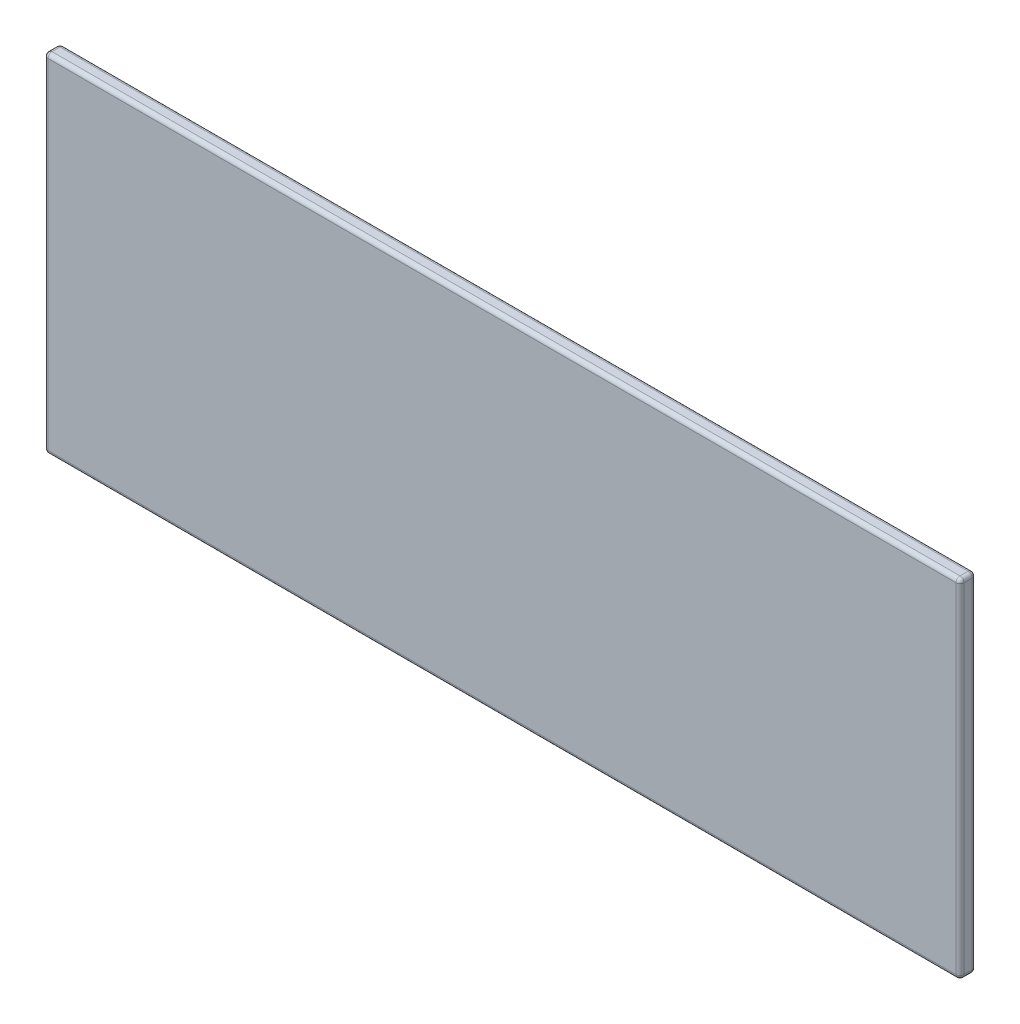
ISO-10303-21;
HEADER;
FILE_DESCRIPTION(('STEP AP214'),'2;1');
FILE_NAME('part.step','',(''),(''),'','','');
FILE_SCHEMA(('AUTOMOTIVE_DESIGN { 1 0 10303 214 1 1 1 1 }'));
ENDSEC;
DATA;
#1=APPLICATION_CONTEXT('core data for automotive mechanical design processes');
#2=APPLICATION_PROTOCOL_DEFINITION('international standard','automotive_design',2000,#1);
#3=PRODUCT_CONTEXT('',#1,'mechanical');
#4=PRODUCT('Part','Part','',(#3));
#5=PRODUCT_RELATED_PRODUCT_CATEGORY('part','',(#4));
#6=PRODUCT_DEFINITION_FORMATION('','',#4);
#7=PRODUCT_DEFINITION_CONTEXT('part definition',#1,'design');
#8=PRODUCT_DEFINITION('design','',#6,#7);
#9=PRODUCT_DEFINITION_SHAPE('','',#8);
#10=(LENGTH_UNIT() NAMED_UNIT(*) SI_UNIT(.MILLI.,.METRE.));
#11=(NAMED_UNIT(*) PLANE_ANGLE_UNIT() SI_UNIT($,.RADIAN.));
#12=(NAMED_UNIT(*) SI_UNIT($,.STERADIAN.) SOLID_ANGLE_UNIT());
#13=UNCERTAINTY_MEASURE_WITH_UNIT(LENGTH_MEASURE(1.E-05),#10,'distance_accuracy_value','');
#14=(GEOMETRIC_REPRESENTATION_CONTEXT(3) GLOBAL_UNCERTAINTY_ASSIGNED_CONTEXT((#13)) GLOBAL_UNIT_ASSIGNED_CONTEXT((#10,
#11,#12)) REPRESENTATION_CONTEXT('',''));
#15=CARTESIAN_POINT('',(0.,0.,0.));
#16=DIRECTION('',(0.,0.,1.));
#17=DIRECTION('',(1.,0.,0.));
#18=AXIS2_PLACEMENT_3D('',#15,#16,#17);
#19=CARTESIAN_POINT('',(57.35,-21.75,2.));
#20=DIRECTION('',(-1.,0.,0.));
#21=DIRECTION('',(0.,0.,1.));
#22=AXIS2_PLACEMENT_3D('',#19,#20,#21);
#23=PLANE('',#22);
#24=DIRECTION('',(0.,1.,0.));
#25=VECTOR('',#24,1.);
#26=CARTESIAN_POINT('',(57.35,-21.75,1.5));
#27=LINE('',#26,#25);
#28=CARTESIAN_POINT('',(57.35,21.25,1.5));
#29=VERTEX_POINT('',#28);
#30=CARTESIAN_POINT('',(57.35,-21.25,1.5));
#31=VERTEX_POINT('',#30);
#32=EDGE_CURVE('E42',#29,#31,#27,.F.);
#33=ORIENTED_EDGE('',*,*,#32,.T.);
#34=DIRECTION('',(0.,0.,-1.));
#35=VECTOR('',#34,1.);
#36=CARTESIAN_POINT('',(57.35,-21.25,2.));
#37=LINE('',#36,#35);
#38=CARTESIAN_POINT('',(57.35,-21.25,0.5));
#39=VERTEX_POINT('',#38);
#40=EDGE_CURVE('E11',#31,#39,#37,.T.);
#41=ORIENTED_EDGE('',*,*,#40,.T.);
#42=DIRECTION('',(0.,1.,0.));
#43=VECTOR('',#42,1.);
#44=CARTESIAN_POINT('',(57.35,21.75,0.5));
#45=LINE('',#44,#43);
#46=CARTESIAN_POINT('',(57.35,21.25,0.5));
#47=VERTEX_POINT('',#46);
#48=EDGE_CURVE('E194',#39,#47,#45,.T.);
#49=ORIENTED_EDGE('',*,*,#48,.T.);
#50=DIRECTION('',(0.,0.,-1.));
#51=VECTOR('',#50,1.);
#52=CARTESIAN_POINT('',(57.35,21.25,2.));
#53=LINE('',#52,#51);
#54=EDGE_CURVE('E53',#47,#29,#53,.F.);
#55=ORIENTED_EDGE('',*,*,#54,.T.);
#56=EDGE_LOOP('',(#33,#41,#49,#55));
#57=FACE_BOUND('',#56,.T.);
#58=ADVANCED_FACE('F33',(#57),#23,.F.);
#59=CARTESIAN_POINT('',(-57.35,21.75,2.));
#60=DIRECTION('',(0.,-1.,0.));
#61=DIRECTION('',(0.,0.,-1.));
#62=AXIS2_PLACEMENT_3D('',#59,#60,#61);
#63=PLANE('',#62);
#64=DIRECTION('',(0.,0.,-1.));
#65=VECTOR('',#64,1.);
#66=CARTESIAN_POINT('',(-56.85,21.75,2.));
#67=LINE('',#66,#65);
#68=CARTESIAN_POINT('',(-56.85,21.75,0.5));
#69=VERTEX_POINT('',#68);
#70=CARTESIAN_POINT('',(-56.85,21.75,1.5));
#71=VERTEX_POINT('',#70);
#72=EDGE_CURVE('E189',#69,#71,#67,.F.);
#73=ORIENTED_EDGE('',*,*,#72,.T.);
#74=DIRECTION('',(-1.,0.,0.));
#75=VECTOR('',#74,1.);
#76=CARTESIAN_POINT('',(-57.35,21.75,1.5));
#77=LINE('',#76,#75);
#78=CARTESIAN_POINT('',(56.85,21.75,1.5));
#79=VERTEX_POINT('',#78);
#80=EDGE_CURVE('E191',#71,#79,#77,.F.);
#81=ORIENTED_EDGE('',*,*,#80,.T.);
#82=DIRECTION('',(0.,0.,-1.));
#83=VECTOR('',#82,1.);
#84=CARTESIAN_POINT('',(56.85,21.75,2.));
#85=LINE('',#84,#83);
#86=CARTESIAN_POINT('',(56.85,21.75,0.5));
#87=VERTEX_POINT('',#86);
#88=EDGE_CURVE('E185',#79,#87,#85,.T.);
#89=ORIENTED_EDGE('',*,*,#88,.T.);
#90=DIRECTION('',(-1.,0.,0.));
#91=VECTOR('',#90,1.);
#92=CARTESIAN_POINT('',(-57.35,21.75,0.5));
#93=LINE('',#92,#91);
#94=EDGE_CURVE('E187',#87,#69,#93,.T.);
#95=ORIENTED_EDGE('',*,*,#94,.T.);
#96=EDGE_LOOP('',(#73,#81,#89,#95));
#97=FACE_BOUND('',#96,.T.);
#98=ADVANCED_FACE('F278',(#97),#63,.F.);
#99=CARTESIAN_POINT('',(-57.35,-21.75,2.));
#100=DIRECTION('',(1.,0.,0.));
#101=DIRECTION('',(0.,0.,-1.));
#102=AXIS2_PLACEMENT_3D('',#99,#100,#101);
#103=PLANE('',#102);
#104=DIRECTION('',(0.,0.,-1.));
#105=VECTOR('',#104,1.);
#106=CARTESIAN_POINT('',(-57.35,-21.25,2.));
#107=LINE('',#106,#105);
#108=CARTESIAN_POINT('',(-57.35,-21.25,0.5));
#109=VERTEX_POINT('',#108);
#110=CARTESIAN_POINT('',(-57.35,-21.25,1.5));
#111=VERTEX_POINT('',#110);
#112=EDGE_CURVE('E180',#109,#111,#107,.F.);
#113=ORIENTED_EDGE('',*,*,#112,.T.);
#114=DIRECTION('',(0.,-1.,0.));
#115=VECTOR('',#114,1.);
#116=CARTESIAN_POINT('',(-57.35,-21.75,1.5));
#117=LINE('',#116,#115);
#118=CARTESIAN_POINT('',(-57.35,21.25,1.5));
#119=VERTEX_POINT('',#118);
#120=EDGE_CURVE('E182',#111,#119,#117,.F.);
#121=ORIENTED_EDGE('',*,*,#120,.T.);
#122=DIRECTION('',(0.,0.,-1.));
#123=VECTOR('',#122,1.);
#124=CARTESIAN_POINT('',(-57.35,21.25,2.));
#125=LINE('',#124,#123);
#126=CARTESIAN_POINT('',(-57.35,21.25,0.5));
#127=VERTEX_POINT('',#126);
#128=EDGE_CURVE('E176',#119,#127,#125,.T.);
#129=ORIENTED_EDGE('',*,*,#128,.T.);
#130=DIRECTION('',(0.,-1.,0.));
#131=VECTOR('',#130,1.);
#132=CARTESIAN_POINT('',(-57.35,-21.75,0.5));
#133=LINE('',#132,#131);
#134=EDGE_CURVE('E178',#127,#109,#133,.T.);
#135=ORIENTED_EDGE('',*,*,#134,.T.);
#136=EDGE_LOOP('',(#113,#121,#129,#135));
#137=FACE_BOUND('',#136,.T.);
#138=ADVANCED_FACE('F269',(#137),#103,.F.);
#139=CARTESIAN_POINT('',(-57.35,-21.75,2.));
#140=DIRECTION('',(0.,1.,0.));
#141=DIRECTION('',(0.,0.,1.));
#142=AXIS2_PLACEMENT_3D('',#139,#140,#141);
#143=PLANE('',#142);
#144=DIRECTION('',(1.,0.,0.));
#145=VECTOR('',#144,1.);
#146=CARTESIAN_POINT('',(-57.35,-21.75,1.5));
#147=LINE('',#146,#145);
#148=CARTESIAN_POINT('',(56.85,-21.75,1.5));
#149=VERTEX_POINT('',#148);
#150=CARTESIAN_POINT('',(-56.85,-21.75,1.5));
#151=VERTEX_POINT('',#150);
#152=EDGE_CURVE('E129',#149,#151,#147,.F.);
#153=ORIENTED_EDGE('',*,*,#152,.T.);
#154=DIRECTION('',(0.,0.,-1.));
#155=VECTOR('',#154,1.);
#156=CARTESIAN_POINT('',(-56.85,-21.75,2.));
#157=LINE('',#156,#155);
#158=CARTESIAN_POINT('',(-56.85,-21.75,0.5));
#159=VERTEX_POINT('',#158);
#160=EDGE_CURVE('E165',#151,#159,#157,.T.);
#161=ORIENTED_EDGE('',*,*,#160,.T.);
#162=DIRECTION('',(1.,0.,0.));
#163=VECTOR('',#162,1.);
#164=CARTESIAN_POINT('',(57.35,-21.75,0.5));
#165=LINE('',#164,#163);
#166=CARTESIAN_POINT('',(56.85,-21.75,0.5));
#167=VERTEX_POINT('',#166);
#168=EDGE_CURVE('E158',#159,#167,#165,.T.);
#169=ORIENTED_EDGE('',*,*,#168,.T.);
#170=DIRECTION('',(0.,0.,-1.));
#171=VECTOR('',#170,1.);
#172=CARTESIAN_POINT('',(56.85,-21.75,2.));
#173=LINE('',#172,#171);
#174=EDGE_CURVE('E156',#167,#149,#173,.F.);
#175=ORIENTED_EDGE('',*,*,#174,.T.);
#176=EDGE_LOOP('',(#153,#161,#169,#175));
#177=FACE_BOUND('',#176,.T.);
#178=ADVANCED_FACE('F356',(#177),#143,.F.);
#179=CARTESIAN_POINT('',(0.,0.,2.));
#180=DIRECTION('',(0.,0.,-1.));
#181=DIRECTION('',(-1.,0.,0.));
#182=AXIS2_PLACEMENT_3D('',#179,#180,#181);
#183=PLANE('',#182);
#184=DIRECTION('',(0.,-1.,0.));
#185=VECTOR('',#184,1.);
#186=CARTESIAN_POINT('',(-56.85,0.,2.));
#187=LINE('',#186,#185);
#188=CARTESIAN_POINT('',(-56.85,21.25,2.));
#189=VERTEX_POINT('',#188);
#190=CARTESIAN_POINT('',(-56.85,-21.25,2.));
#191=VERTEX_POINT('',#190);
#192=EDGE_CURVE('E154',#189,#191,#187,.T.);
#193=ORIENTED_EDGE('',*,*,#192,.T.);
#194=DIRECTION('',(1.,0.,0.));
#195=VECTOR('',#194,1.);
#196=CARTESIAN_POINT('',(0.,-21.25,2.));
#197=LINE('',#196,#195);
#198=CARTESIAN_POINT('',(56.85,-21.25,2.));
#199=VERTEX_POINT('',#198);
#200=EDGE_CURVE('E127',#191,#199,#197,.T.);
#201=ORIENTED_EDGE('',*,*,#200,.T.);
#202=DIRECTION('',(0.,1.,0.));
#203=VECTOR('',#202,1.);
#204=CARTESIAN_POINT('',(56.85,0.,2.));
#205=LINE('',#204,#203);
#206=CARTESIAN_POINT('',(56.85,21.25,2.));
#207=VERTEX_POINT('',#206);
#208=EDGE_CURVE('E144',#199,#207,#205,.T.);
#209=ORIENTED_EDGE('',*,*,#208,.T.);
#210=DIRECTION('',(-1.,0.,0.));
#211=VECTOR('',#210,1.);
#212=CARTESIAN_POINT('',(0.,21.25,2.));
#213=LINE('',#212,#211);
#214=EDGE_CURVE('E150',#207,#189,#213,.T.);
#215=ORIENTED_EDGE('',*,*,#214,.T.);
#216=EDGE_LOOP('',(#193,#201,#209,#215));
#217=FACE_BOUND('',#216,.T.);
#218=ADVANCED_FACE('F152',(#217),#183,.F.);
#219=CARTESIAN_POINT('',(0.,0.,0.));
#220=DIRECTION('',(0.,0.,-1.));
#221=DIRECTION('',(-1.,0.,0.));
#222=AXIS2_PLACEMENT_3D('',#219,#220,#221);
#223=PLANE('',#222);
#224=DIRECTION('',(0.,1.,0.));
#225=VECTOR('',#224,1.);
#226=CARTESIAN_POINT('',(56.85,-21.75,0.));
#227=LINE('',#226,#225);
#228=CARTESIAN_POINT('',(56.85,21.25,0.));
#229=VERTEX_POINT('',#228);
#230=CARTESIAN_POINT('',(56.85,-21.25,0.));
#231=VERTEX_POINT('',#230);
#232=EDGE_CURVE('E167',#229,#231,#227,.F.);
#233=ORIENTED_EDGE('',*,*,#232,.T.);
#234=DIRECTION('',(1.,0.,0.));
#235=VECTOR('',#234,1.);
#236=CARTESIAN_POINT('',(-57.35,-21.25,0.));
#237=LINE('',#236,#235);
#238=CARTESIAN_POINT('',(-56.85,-21.25,0.));
#239=VERTEX_POINT('',#238);
#240=EDGE_CURVE('E173',#231,#239,#237,.F.);
#241=ORIENTED_EDGE('',*,*,#240,.T.);
#242=DIRECTION('',(0.,-1.,0.));
#243=VECTOR('',#242,1.);
#244=CARTESIAN_POINT('',(-56.85,21.75,0.));
#245=LINE('',#244,#243);
#246=CARTESIAN_POINT('',(-56.85,21.25,0.));
#247=VERTEX_POINT('',#246);
#248=EDGE_CURVE('E171',#239,#247,#245,.F.);
#249=ORIENTED_EDGE('',*,*,#248,.T.);
#250=DIRECTION('',(-1.,0.,0.));
#251=VECTOR('',#250,1.);
#252=CARTESIAN_POINT('',(57.35,21.25,0.));
#253=LINE('',#252,#251);
#254=EDGE_CURVE('E169',#247,#229,#253,.F.);
#255=ORIENTED_EDGE('',*,*,#254,.T.);
#256=EDGE_LOOP('',(#233,#241,#249,#255));
#257=FACE_BOUND('',#256,.T.);
#258=ADVANCED_FACE('F296',(#257),#223,.T.);
#259=CARTESIAN_POINT('',(-57.35,21.25,0.5));
#260=DIRECTION('',(1.,0.,0.));
#261=DIRECTION('',(0.,0.,-1.));
#262=AXIS2_PLACEMENT_3D('',#259,#260,#261);
#263=CYLINDRICAL_SURFACE('',#262,0.5);
#264=CARTESIAN_POINT('',(-56.85,21.25,0.5));
#265=DIRECTION('',(-1.,0.,0.));
#266=DIRECTION('',(0.,0.,1.));
#267=AXIS2_PLACEMENT_3D('',#264,#265,#266);
#268=CIRCLE('',#267,0.5);
#269=EDGE_CURVE('E37',#69,#247,#268,.T.);
#270=ORIENTED_EDGE('',*,*,#269,.F.);
#271=ORIENTED_EDGE('',*,*,#94,.F.);
#272=CARTESIAN_POINT('',(56.85,21.25,0.5));
#273=DIRECTION('',(1.,0.,0.));
#274=DIRECTION('',(0.,0.,-1.));
#275=AXIS2_PLACEMENT_3D('',#272,#273,#274);
#276=CIRCLE('',#275,0.5);
#277=EDGE_CURVE('E246',#229,#87,#276,.T.);
#278=ORIENTED_EDGE('',*,*,#277,.F.);
#279=ORIENTED_EDGE('',*,*,#254,.F.);
#280=EDGE_LOOP('',(#270,#271,#278,#279));
#281=FACE_BOUND('',#280,.T.);
#282=ADVANCED_FACE('F35',(#281),#263,.T.);
#283=CARTESIAN_POINT('',(-56.85,21.25,0.5));
#284=DIRECTION('',(0.,0.,1.));
#285=DIRECTION('',(1.,0.,0.));
#286=AXIS2_PLACEMENT_3D('',#283,#284,#285);
#287=SPHERICAL_SURFACE('',#286,0.5);
#288=CARTESIAN_POINT('',(-56.85,21.25,0.5));
#289=DIRECTION('',(0.,0.,-1.));
#290=DIRECTION('',(-1.,0.,0.));
#291=AXIS2_PLACEMENT_3D('',#288,#289,#290);
#292=CIRCLE('',#291,0.5);
#293=EDGE_CURVE('E241',#69,#127,#292,.F.);
#294=ORIENTED_EDGE('',*,*,#293,.F.);
#295=ORIENTED_EDGE('',*,*,#269,.T.);
#296=CARTESIAN_POINT('',(-56.85,21.25,0.5));
#297=DIRECTION('',(0.,1.,0.));
#298=DIRECTION('',(0.,0.,1.));
#299=AXIS2_PLACEMENT_3D('',#296,#297,#298);
#300=CIRCLE('',#299,0.5);
#301=EDGE_CURVE('E244',#127,#247,#300,.F.);
#302=ORIENTED_EDGE('',*,*,#301,.F.);
#303=EDGE_LOOP('',(#294,#295,#302));
#304=FACE_BOUND('',#303,.T.);
#305=ADVANCED_FACE('F257',(#304),#287,.T.);
#306=CARTESIAN_POINT('',(56.85,21.25,0.5));
#307=DIRECTION('',(0.,0.,1.));
#308=DIRECTION('',(1.,0.,0.));
#309=AXIS2_PLACEMENT_3D('',#306,#307,#308);
#310=SPHERICAL_SURFACE('',#309,0.5);
#311=CARTESIAN_POINT('',(56.85,21.25,0.5));
#312=DIRECTION('',(0.,1.,0.));
#313=DIRECTION('',(0.,0.,1.));
#314=AXIS2_PLACEMENT_3D('',#311,#312,#313);
#315=CIRCLE('',#314,0.5);
#316=EDGE_CURVE('E235',#229,#47,#315,.F.);
#317=ORIENTED_EDGE('',*,*,#316,.F.);
#318=ORIENTED_EDGE('',*,*,#277,.T.);
#319=CARTESIAN_POINT('',(56.85,21.25,0.5));
#320=DIRECTION('',(0.,0.,-1.));
#321=DIRECTION('',(-1.,0.,0.));
#322=AXIS2_PLACEMENT_3D('',#319,#320,#321);
#323=CIRCLE('',#322,0.5);
#324=EDGE_CURVE('E238',#47,#87,#323,.F.);
#325=ORIENTED_EDGE('',*,*,#324,.F.);
#326=EDGE_LOOP('',(#317,#318,#325));
#327=FACE_BOUND('',#326,.T.);
#328=ADVANCED_FACE('F289',(#327),#310,.T.);
#329=CARTESIAN_POINT('',(-56.85,-21.75,0.5));
#330=DIRECTION('',(0.,1.,0.));
#331=DIRECTION('',(0.,0.,1.));
#332=AXIS2_PLACEMENT_3D('',#329,#330,#331);
#333=CYLINDRICAL_SURFACE('',#332,0.5);
#334=ORIENTED_EDGE('',*,*,#301,.T.);
#335=ORIENTED_EDGE('',*,*,#248,.F.);
#336=CARTESIAN_POINT('',(-56.85,-21.25,0.5));
#337=DIRECTION('',(0.,-1.,0.));
#338=DIRECTION('',(0.,0.,-1.));
#339=AXIS2_PLACEMENT_3D('',#336,#337,#338);
#340=CIRCLE('',#339,0.5);
#341=EDGE_CURVE('E230',#109,#239,#340,.T.);
#342=ORIENTED_EDGE('',*,*,#341,.F.);
#343=ORIENTED_EDGE('',*,*,#134,.F.);
#344=EDGE_LOOP('',(#334,#335,#342,#343));
#345=FACE_BOUND('',#344,.T.);
#346=ADVANCED_FACE('F265',(#345),#333,.T.);
#347=CARTESIAN_POINT('',(-56.85,21.25,2.));
#348=DIRECTION('',(0.,0.,-1.));
#349=DIRECTION('',(-1.,0.,0.));
#350=AXIS2_PLACEMENT_3D('',#347,#348,#349);
#351=CYLINDRICAL_SURFACE('',#350,0.5);
#352=ORIENTED_EDGE('',*,*,#293,.T.);
#353=ORIENTED_EDGE('',*,*,#128,.F.);
#354=CARTESIAN_POINT('',(-56.85,21.25,1.5));
#355=DIRECTION('',(0.,0.,1.));
#356=DIRECTION('',(1.,0.,0.));
#357=AXIS2_PLACEMENT_3D('',#354,#355,#356);
#358=CIRCLE('',#357,0.5);
#359=EDGE_CURVE('E227',#71,#119,#358,.T.);
#360=ORIENTED_EDGE('',*,*,#359,.F.);
#361=ORIENTED_EDGE('',*,*,#72,.F.);
#362=EDGE_LOOP('',(#352,#353,#360,#361));
#363=FACE_BOUND('',#362,.T.);
#364=ADVANCED_FACE('F275',(#363),#351,.T.);
#365=CARTESIAN_POINT('',(0.,21.25,1.5));
#366=DIRECTION('',(-1.,0.,0.));
#367=DIRECTION('',(0.,0.,1.));
#368=AXIS2_PLACEMENT_3D('',#365,#366,#367);
#369=CYLINDRICAL_SURFACE('',#368,0.5);
#370=CARTESIAN_POINT('',(56.85,21.25,1.5));
#371=DIRECTION('',(1.,0.,0.));
#372=DIRECTION('',(0.,0.,-1.));
#373=AXIS2_PLACEMENT_3D('',#370,#371,#372);
#374=CIRCLE('',#373,0.5);
#375=EDGE_CURVE('E221',#79,#207,#374,.T.);
#376=ORIENTED_EDGE('',*,*,#375,.F.);
#377=ORIENTED_EDGE('',*,*,#80,.F.);
#378=CARTESIAN_POINT('',(-56.85,21.25,1.5));
#379=DIRECTION('',(-1.,0.,0.));
#380=DIRECTION('',(0.,0.,1.));
#381=AXIS2_PLACEMENT_3D('',#378,#379,#380);
#382=CIRCLE('',#381,0.5);
#383=EDGE_CURVE('E224',#189,#71,#382,.T.);
#384=ORIENTED_EDGE('',*,*,#383,.F.);
#385=ORIENTED_EDGE('',*,*,#214,.F.);
#386=EDGE_LOOP('',(#376,#377,#384,#385));
#387=FACE_BOUND('',#386,.T.);
#388=ADVANCED_FACE('F282',(#387),#369,.T.);
#389=CARTESIAN_POINT('',(56.85,21.25,2.));
#390=DIRECTION('',(0.,0.,-1.));
#391=DIRECTION('',(-1.,0.,0.));
#392=AXIS2_PLACEMENT_3D('',#389,#390,#391);
#393=CYLINDRICAL_SURFACE('',#392,0.5);
#394=ORIENTED_EDGE('',*,*,#324,.T.);
#395=ORIENTED_EDGE('',*,*,#88,.F.);
#396=CARTESIAN_POINT('',(56.85,21.25,1.5));
#397=DIRECTION('',(0.,0.,1.));
#398=DIRECTION('',(1.,0.,0.));
#399=AXIS2_PLACEMENT_3D('',#396,#397,#398);
#400=CIRCLE('',#399,0.5);
#401=EDGE_CURVE('E219',#29,#79,#400,.T.);
#402=ORIENTED_EDGE('',*,*,#401,.F.);
#403=ORIENTED_EDGE('',*,*,#54,.F.);
#404=EDGE_LOOP('',(#394,#395,#402,#403));
#405=FACE_BOUND('',#404,.T.);
#406=ADVANCED_FACE('F287',(#405),#393,.T.);
#407=CARTESIAN_POINT('',(56.85,-21.75,0.5));
#408=DIRECTION('',(0.,-1.,0.));
#409=DIRECTION('',(0.,0.,-1.));
#410=AXIS2_PLACEMENT_3D('',#407,#408,#409);
#411=CYLINDRICAL_SURFACE('',#410,0.5);
#412=ORIENTED_EDGE('',*,*,#316,.T.);
#413=ORIENTED_EDGE('',*,*,#48,.F.);
#414=CARTESIAN_POINT('',(56.85,-21.25,0.5));
#415=DIRECTION('',(0.,-1.,0.));
#416=DIRECTION('',(0.,0.,-1.));
#417=AXIS2_PLACEMENT_3D('',#414,#415,#416);
#418=CIRCLE('',#417,0.5);
#419=EDGE_CURVE('E216',#231,#39,#418,.T.);
#420=ORIENTED_EDGE('',*,*,#419,.F.);
#421=ORIENTED_EDGE('',*,*,#232,.F.);
#422=EDGE_LOOP('',(#412,#413,#420,#421));
#423=FACE_BOUND('',#422,.T.);
#424=ADVANCED_FACE('F293',(#423),#411,.T.);
#425=CARTESIAN_POINT('',(-57.35,-21.25,0.5));
#426=DIRECTION('',(-1.,0.,0.));
#427=DIRECTION('',(0.,0.,1.));
#428=AXIS2_PLACEMENT_3D('',#425,#426,#427);
#429=CYLINDRICAL_SURFACE('',#428,0.5);
#430=CARTESIAN_POINT('',(-56.85,-21.25,0.5));
#431=DIRECTION('',(-1.,0.,0.));
#432=DIRECTION('',(0.,0.,1.));
#433=AXIS2_PLACEMENT_3D('',#430,#431,#432);
#434=CIRCLE('',#433,0.5);
#435=EDGE_CURVE('E232',#239,#159,#434,.T.);
#436=ORIENTED_EDGE('',*,*,#435,.F.);
#437=ORIENTED_EDGE('',*,*,#240,.F.);
#438=CARTESIAN_POINT('',(56.85,-21.25,0.5));
#439=DIRECTION('',(1.,0.,0.));
#440=DIRECTION('',(0.,0.,-1.));
#441=AXIS2_PLACEMENT_3D('',#438,#439,#440);
#442=CIRCLE('',#441,0.5);
#443=EDGE_CURVE('E213',#167,#231,#442,.T.);
#444=ORIENTED_EDGE('',*,*,#443,.F.);
#445=ORIENTED_EDGE('',*,*,#168,.F.);
#446=EDGE_LOOP('',(#436,#437,#444,#445));
#447=FACE_BOUND('',#446,.T.);
#448=ADVANCED_FACE('F300',(#447),#429,.T.);
#449=CARTESIAN_POINT('',(-56.85,-21.25,0.5));
#450=DIRECTION('',(0.,0.,1.));
#451=DIRECTION('',(1.,0.,0.));
#452=AXIS2_PLACEMENT_3D('',#449,#450,#451);
#453=SPHERICAL_SURFACE('',#452,0.5);
#454=ORIENTED_EDGE('',*,*,#341,.T.);
#455=ORIENTED_EDGE('',*,*,#435,.T.);
#456=CARTESIAN_POINT('',(-56.85,-21.25,0.5));
#457=DIRECTION('',(0.,0.,-1.));
#458=DIRECTION('',(-1.,0.,0.));
#459=AXIS2_PLACEMENT_3D('',#456,#457,#458);
#460=CIRCLE('',#459,0.5);
#461=EDGE_CURVE('E210',#109,#159,#460,.F.);
#462=ORIENTED_EDGE('',*,*,#461,.F.);
#463=EDGE_LOOP('',(#454,#455,#462));
#464=FACE_BOUND('',#463,.T.);
#465=ADVANCED_FACE('F304',(#464),#453,.T.);
#466=CARTESIAN_POINT('',(-56.85,21.25,1.5));
#467=DIRECTION('',(0.,0.,1.));
#468=DIRECTION('',(1.,0.,0.));
#469=AXIS2_PLACEMENT_3D('',#466,#467,#468);
#470=SPHERICAL_SURFACE('',#469,0.5);
#471=ORIENTED_EDGE('',*,*,#383,.T.);
#472=ORIENTED_EDGE('',*,*,#359,.T.);
#473=CARTESIAN_POINT('',(-56.85,21.25,1.5));
#474=DIRECTION('',(0.,1.,0.));
#475=DIRECTION('',(0.,0.,1.));
#476=AXIS2_PLACEMENT_3D('',#473,#474,#475);
#477=CIRCLE('',#476,0.5);
#478=EDGE_CURVE('E208',#189,#119,#477,.F.);
#479=ORIENTED_EDGE('',*,*,#478,.F.);
#480=EDGE_LOOP('',(#471,#472,#479));
#481=FACE_BOUND('',#480,.T.);
#482=ADVANCED_FACE('F315',(#481),#470,.T.);
#483=CARTESIAN_POINT('',(56.85,21.25,1.5));
#484=DIRECTION('',(0.,0.,1.));
#485=DIRECTION('',(1.,0.,0.));
#486=AXIS2_PLACEMENT_3D('',#483,#484,#485);
#487=SPHERICAL_SURFACE('',#486,0.5);
#488=ORIENTED_EDGE('',*,*,#401,.T.);
#489=ORIENTED_EDGE('',*,*,#375,.T.);
#490=CARTESIAN_POINT('',(56.85,21.25,1.5));
#491=DIRECTION('',(0.,1.,0.));
#492=DIRECTION('',(0.,0.,1.));
#493=AXIS2_PLACEMENT_3D('',#490,#491,#492);
#494=CIRCLE('',#493,0.5);
#495=EDGE_CURVE('E147',#29,#207,#494,.F.);
#496=ORIENTED_EDGE('',*,*,#495,.F.);
#497=EDGE_LOOP('',(#488,#489,#496));
#498=FACE_BOUND('',#497,.T.);
#499=ADVANCED_FACE('F317',(#498),#487,.T.);
#500=CARTESIAN_POINT('',(56.85,-21.25,0.5));
#501=DIRECTION('',(0.,0.,1.));
#502=DIRECTION('',(1.,0.,0.));
#503=AXIS2_PLACEMENT_3D('',#500,#501,#502);
#504=SPHERICAL_SURFACE('',#503,0.5);
#505=ORIENTED_EDGE('',*,*,#443,.T.);
#506=ORIENTED_EDGE('',*,*,#419,.T.);
#507=CARTESIAN_POINT('',(56.85,-21.25,0.5));
#508=DIRECTION('',(0.,0.,-1.));
#509=DIRECTION('',(-1.,0.,0.));
#510=AXIS2_PLACEMENT_3D('',#507,#508,#509);
#511=CIRCLE('',#510,0.5);
#512=EDGE_CURVE('E205',#167,#39,#511,.F.);
#513=ORIENTED_EDGE('',*,*,#512,.F.);
#514=EDGE_LOOP('',(#505,#506,#513));
#515=FACE_BOUND('',#514,.T.);
#516=ADVANCED_FACE('F323',(#515),#504,.T.);
#517=CARTESIAN_POINT('',(-56.85,-21.25,2.));
#518=DIRECTION('',(0.,0.,-1.));
#519=DIRECTION('',(-1.,0.,0.));
#520=AXIS2_PLACEMENT_3D('',#517,#518,#519);
#521=CYLINDRICAL_SURFACE('',#520,0.5);
#522=ORIENTED_EDGE('',*,*,#461,.T.);
#523=ORIENTED_EDGE('',*,*,#160,.F.);
#524=CARTESIAN_POINT('',(-56.85,-21.25,1.5));
#525=DIRECTION('',(0.,0.,1.));
#526=DIRECTION('',(1.,0.,0.));
#527=AXIS2_PLACEMENT_3D('',#524,#525,#526);
#528=CIRCLE('',#527,0.5);
#529=EDGE_CURVE('E202',#111,#151,#528,.T.);
#530=ORIENTED_EDGE('',*,*,#529,.F.);
#531=ORIENTED_EDGE('',*,*,#112,.F.);
#532=EDGE_LOOP('',(#522,#523,#530,#531));
#533=FACE_BOUND('',#532,.T.);
#534=ADVANCED_FACE('F307',(#533),#521,.T.);
#535=CARTESIAN_POINT('',(-56.85,0.,1.5));
#536=DIRECTION('',(0.,-1.,0.));
#537=DIRECTION('',(0.,0.,-1.));
#538=AXIS2_PLACEMENT_3D('',#535,#536,#537);
#539=CYLINDRICAL_SURFACE('',#538,0.5);
#540=ORIENTED_EDGE('',*,*,#478,.T.);
#541=ORIENTED_EDGE('',*,*,#120,.F.);
#542=CARTESIAN_POINT('',(-56.85,-21.25,1.5));
#543=DIRECTION('',(0.,-1.,0.));
#544=DIRECTION('',(0.,0.,-1.));
#545=AXIS2_PLACEMENT_3D('',#542,#543,#544);
#546=CIRCLE('',#545,0.5);
#547=EDGE_CURVE('E141',#191,#111,#546,.T.);
#548=ORIENTED_EDGE('',*,*,#547,.F.);
#549=ORIENTED_EDGE('',*,*,#192,.F.);
#550=EDGE_LOOP('',(#540,#541,#548,#549));
#551=FACE_BOUND('',#550,.T.);
#552=ADVANCED_FACE('F313',(#551),#539,.T.);
#553=CARTESIAN_POINT('',(56.85,0.,1.5));
#554=DIRECTION('',(0.,1.,0.));
#555=DIRECTION('',(0.,0.,1.));
#556=AXIS2_PLACEMENT_3D('',#553,#554,#555);
#557=CYLINDRICAL_SURFACE('',#556,0.5);
#558=ORIENTED_EDGE('',*,*,#495,.T.);
#559=ORIENTED_EDGE('',*,*,#208,.F.);
#560=CARTESIAN_POINT('',(56.85,-21.25,1.5));
#561=DIRECTION('',(0.,-1.,0.));
#562=DIRECTION('',(0.,0.,-1.));
#563=AXIS2_PLACEMENT_3D('',#560,#561,#562);
#564=CIRCLE('',#563,0.5);
#565=EDGE_CURVE('E135',#31,#199,#564,.T.);
#566=ORIENTED_EDGE('',*,*,#565,.F.);
#567=ORIENTED_EDGE('',*,*,#32,.F.);
#568=EDGE_LOOP('',(#558,#559,#566,#567));
#569=FACE_BOUND('',#568,.T.);
#570=ADVANCED_FACE('F145',(#569),#557,.T.);
#571=CARTESIAN_POINT('',(56.85,-21.25,2.));
#572=DIRECTION('',(0.,0.,-1.));
#573=DIRECTION('',(-1.,0.,0.));
#574=AXIS2_PLACEMENT_3D('',#571,#572,#573);
#575=CYLINDRICAL_SURFACE('',#574,0.5);
#576=ORIENTED_EDGE('',*,*,#512,.T.);
#577=ORIENTED_EDGE('',*,*,#40,.F.);
#578=CARTESIAN_POINT('',(56.85,-21.25,1.5));
#579=DIRECTION('',(0.,0.,1.));
#580=DIRECTION('',(1.,0.,0.));
#581=AXIS2_PLACEMENT_3D('',#578,#579,#580);
#582=CIRCLE('',#581,0.5);
#583=EDGE_CURVE('E139',#149,#31,#582,.T.);
#584=ORIENTED_EDGE('',*,*,#583,.F.);
#585=ORIENTED_EDGE('',*,*,#174,.F.);
#586=EDGE_LOOP('',(#576,#577,#584,#585));
#587=FACE_BOUND('',#586,.T.);
#588=ADVANCED_FACE('F340',(#587),#575,.T.);
#589=CARTESIAN_POINT('',(-56.85,-21.25,1.5));
#590=DIRECTION('',(0.,0.,1.));
#591=DIRECTION('',(1.,0.,0.));
#592=AXIS2_PLACEMENT_3D('',#589,#590,#591);
#593=SPHERICAL_SURFACE('',#592,0.5);
#594=ORIENTED_EDGE('',*,*,#547,.T.);
#595=ORIENTED_EDGE('',*,*,#529,.T.);
#596=CARTESIAN_POINT('',(-56.85,-21.25,1.5));
#597=DIRECTION('',(-1.,0.,0.));
#598=DIRECTION('',(0.,0.,1.));
#599=AXIS2_PLACEMENT_3D('',#596,#597,#598);
#600=CIRCLE('',#599,0.5);
#601=EDGE_CURVE('E132',#191,#151,#600,.F.);
#602=ORIENTED_EDGE('',*,*,#601,.F.);
#603=EDGE_LOOP('',(#594,#595,#602));
#604=FACE_BOUND('',#603,.T.);
#605=ADVANCED_FACE('F311',(#604),#593,.T.);
#606=CARTESIAN_POINT('',(56.85,-21.25,1.5));
#607=DIRECTION('',(0.,0.,1.));
#608=DIRECTION('',(1.,0.,0.));
#609=AXIS2_PLACEMENT_3D('',#606,#607,#608);
#610=SPHERICAL_SURFACE('',#609,0.5);
#611=ORIENTED_EDGE('',*,*,#583,.T.);
#612=ORIENTED_EDGE('',*,*,#565,.T.);
#613=CARTESIAN_POINT('',(56.85,-21.25,1.5));
#614=DIRECTION('',(1.,0.,0.));
#615=DIRECTION('',(0.,0.,-1.));
#616=AXIS2_PLACEMENT_3D('',#613,#614,#615);
#617=CIRCLE('',#616,0.5);
#618=EDGE_CURVE('E123',#149,#199,#617,.F.);
#619=ORIENTED_EDGE('',*,*,#618,.F.);
#620=EDGE_LOOP('',(#611,#612,#619));
#621=FACE_BOUND('',#620,.T.);
#622=ADVANCED_FACE('F137',(#621),#610,.T.);
#623=CARTESIAN_POINT('',(0.,-21.25,1.5));
#624=DIRECTION('',(1.,0.,0.));
#625=DIRECTION('',(0.,0.,-1.));
#626=AXIS2_PLACEMENT_3D('',#623,#624,#625);
#627=CYLINDRICAL_SURFACE('',#626,0.5);
#628=ORIENTED_EDGE('',*,*,#601,.T.);
#629=ORIENTED_EDGE('',*,*,#152,.F.);
#630=ORIENTED_EDGE('',*,*,#618,.T.);
#631=ORIENTED_EDGE('',*,*,#200,.F.);
#632=EDGE_LOOP('',(#628,#629,#630,#631));
#633=FACE_BOUND('',#632,.T.);
#634=ADVANCED_FACE('F125',(#633),#627,.T.);
#635=CLOSED_SHELL('',(#58,#98,#138,#178,#218,#258,#282,#305,#328,#346,#364,#388,#406,#424,#448,
#465,#482,#499,#516,#534,#552,#570,#588,#605,#622,#634));
#636=MANIFOLD_SOLID_BREP('B2',#635);
#637=ADVANCED_BREP_SHAPE_REPRESENTATION('',(#18,#636),#14);
#638=SHAPE_DEFINITION_REPRESENTATION(#9,#637);
ENDSEC;
END-ISO-10303-21;
